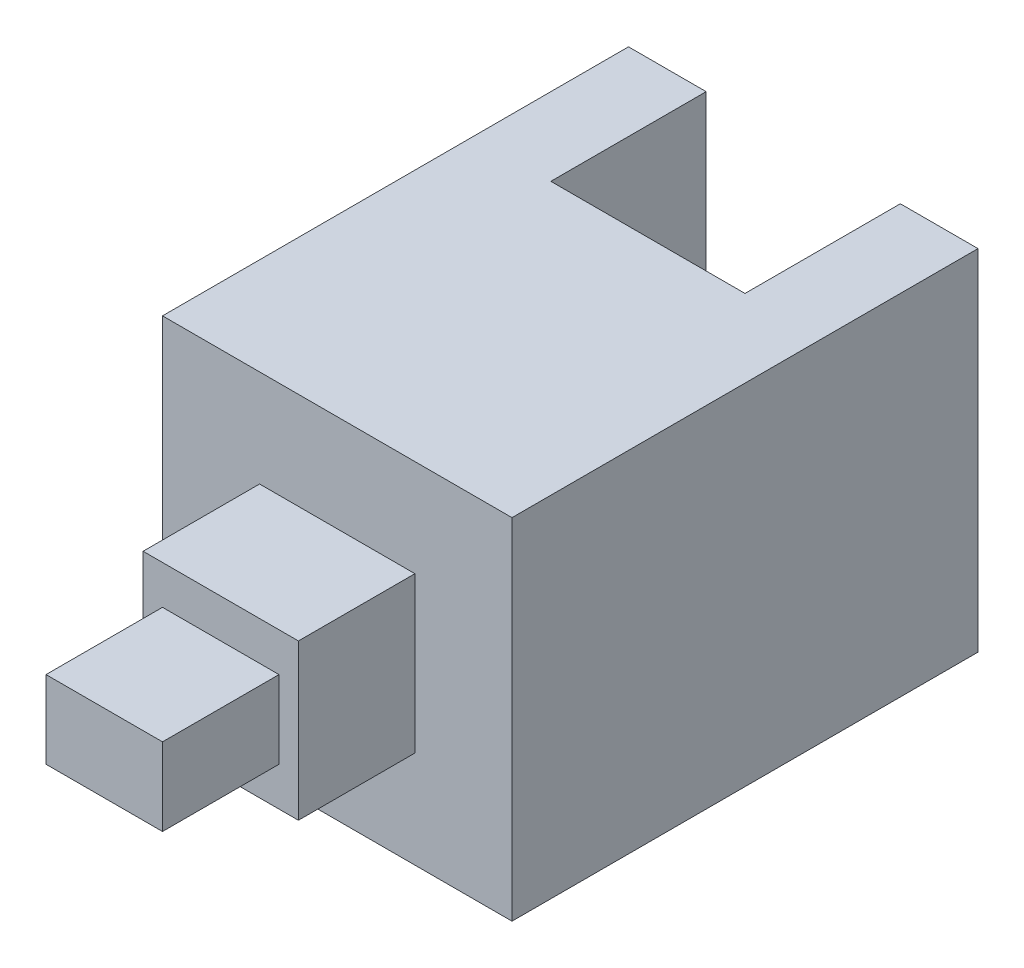
ISO-10303-21;
HEADER;
FILE_DESCRIPTION(('STEP AP214'),'2;1');
FILE_NAME('part.step','',(''),(''),'','','');
FILE_SCHEMA(('AUTOMOTIVE_DESIGN { 1 0 10303 214 1 1 1 1 }'));
ENDSEC;
DATA;
#1=APPLICATION_CONTEXT('core data for automotive mechanical design processes');
#2=APPLICATION_PROTOCOL_DEFINITION('international standard','automotive_design',2000,#1);
#3=PRODUCT_CONTEXT('',#1,'mechanical');
#4=PRODUCT('Part','Part','',(#3));
#5=PRODUCT_RELATED_PRODUCT_CATEGORY('part','',(#4));
#6=PRODUCT_DEFINITION_FORMATION('','',#4);
#7=PRODUCT_DEFINITION_CONTEXT('part definition',#1,'design');
#8=PRODUCT_DEFINITION('design','',#6,#7);
#9=PRODUCT_DEFINITION_SHAPE('','',#8);
#10=(LENGTH_UNIT() NAMED_UNIT(*) SI_UNIT(.MILLI.,.METRE.));
#11=(NAMED_UNIT(*) PLANE_ANGLE_UNIT() SI_UNIT($,.RADIAN.));
#12=(NAMED_UNIT(*) SI_UNIT($,.STERADIAN.) SOLID_ANGLE_UNIT());
#13=UNCERTAINTY_MEASURE_WITH_UNIT(LENGTH_MEASURE(1.E-05),#10,'distance_accuracy_value','');
#14=(GEOMETRIC_REPRESENTATION_CONTEXT(3) GLOBAL_UNCERTAINTY_ASSIGNED_CONTEXT((#13)) GLOBAL_UNIT_ASSIGNED_CONTEXT((#10,
#11,#12)) REPRESENTATION_CONTEXT('',''));
#15=CARTESIAN_POINT('',(0.,0.,0.));
#16=DIRECTION('',(0.,0.,1.));
#17=DIRECTION('',(1.,0.,0.));
#18=AXIS2_PLACEMENT_3D('',#15,#16,#17);
#19=CARTESIAN_POINT('',(0.,0.,0.));
#20=DIRECTION('',(0.,0.,1.));
#21=DIRECTION('',(1.,0.,0.));
#22=AXIS2_PLACEMENT_3D('',#19,#20,#21);
#23=PLANE('',#22);
#24=DIRECTION('',(0.,-1.,0.));
#25=VECTOR('',#24,1.);
#26=CARTESIAN_POINT('',(-2.5,4.5,0.));
#27=LINE('',#26,#25);
#28=CARTESIAN_POINT('',(-2.5,4.5,0.));
#29=VERTEX_POINT('',#28);
#30=CARTESIAN_POINT('',(-2.5,-4.5,0.));
#31=VERTEX_POINT('',#30);
#32=EDGE_CURVE('E177',#29,#31,#27,.T.);
#33=ORIENTED_EDGE('',*,*,#32,.F.);
#34=DIRECTION('',(-1.,0.,0.));
#35=VECTOR('',#34,1.);
#36=CARTESIAN_POINT('',(-4.5,4.5,0.));
#37=LINE('',#36,#35);
#38=CARTESIAN_POINT('',(2.5,4.5,0.));
#39=VERTEX_POINT('',#38);
#40=EDGE_CURVE('E306',#39,#29,#37,.T.);
#41=ORIENTED_EDGE('',*,*,#40,.F.);
#42=DIRECTION('',(0.,1.,0.));
#43=VECTOR('',#42,1.);
#44=CARTESIAN_POINT('',(2.5,4.5,0.));
#45=LINE('',#44,#43);
#46=CARTESIAN_POINT('',(2.5,-4.5,0.));
#47=VERTEX_POINT('',#46);
#48=EDGE_CURVE('E190',#47,#39,#45,.T.);
#49=ORIENTED_EDGE('',*,*,#48,.F.);
#50=DIRECTION('',(1.,0.,0.));
#51=VECTOR('',#50,1.);
#52=CARTESIAN_POINT('',(-4.5,-4.5,0.));
#53=LINE('',#52,#51);
#54=EDGE_CURVE('E60',#31,#47,#53,.T.);
#55=ORIENTED_EDGE('',*,*,#54,.F.);
#56=EDGE_LOOP('',(#33,#41,#49,#55));
#57=FACE_BOUND('',#56,.T.);
#58=ADVANCED_FACE('F39',(#57),#23,.F.);
#59=CARTESIAN_POINT('',(4.5,4.5,8.));
#60=DIRECTION('',(-1.,0.,0.));
#61=DIRECTION('',(0.,-1.,0.));
#62=AXIS2_PLACEMENT_3D('',#59,#60,#61);
#63=PLANE('',#62);
#64=DIRECTION('',(0.,0.,-1.));
#65=VECTOR('',#64,1.);
#66=CARTESIAN_POINT('',(4.5,-4.5,8.));
#67=LINE('',#66,#65);
#68=CARTESIAN_POINT('',(4.5,-4.5,8.));
#69=VERTEX_POINT('',#68);
#70=CARTESIAN_POINT('',(4.5,-4.5,-4.));
#71=VERTEX_POINT('',#70);
#72=EDGE_CURVE('E319',#69,#71,#67,.T.);
#73=ORIENTED_EDGE('',*,*,#72,.T.);
#74=DIRECTION('',(0.,-1.,0.));
#75=VECTOR('',#74,1.);
#76=CARTESIAN_POINT('',(4.5,4.5,-4.));
#77=LINE('',#76,#75);
#78=CARTESIAN_POINT('',(4.5,4.5,-4.));
#79=VERTEX_POINT('',#78);
#80=EDGE_CURVE('E191',#79,#71,#77,.T.);
#81=ORIENTED_EDGE('',*,*,#80,.F.);
#82=DIRECTION('',(0.,0.,-1.));
#83=VECTOR('',#82,1.);
#84=CARTESIAN_POINT('',(4.5,4.5,8.));
#85=LINE('',#84,#83);
#86=CARTESIAN_POINT('',(4.5,4.5,8.));
#87=VERTEX_POINT('',#86);
#88=EDGE_CURVE('E11',#87,#79,#85,.T.);
#89=ORIENTED_EDGE('',*,*,#88,.F.);
#90=DIRECTION('',(0.,1.,0.));
#91=VECTOR('',#90,1.);
#92=CARTESIAN_POINT('',(4.5,4.5,8.));
#93=LINE('',#92,#91);
#94=EDGE_CURVE('E307',#69,#87,#93,.T.);
#95=ORIENTED_EDGE('',*,*,#94,.F.);
#96=EDGE_LOOP('',(#73,#81,#89,#95));
#97=FACE_BOUND('',#96,.T.);
#98=ADVANCED_FACE('F41',(#97),#63,.F.);
#99=CARTESIAN_POINT('',(-4.5,4.5,8.));
#100=DIRECTION('',(0.,-1.,0.));
#101=DIRECTION('',(0.,0.,-1.));
#102=AXIS2_PLACEMENT_3D('',#99,#100,#101);
#103=PLANE('',#102);
#104=ORIENTED_EDGE('',*,*,#88,.T.);
#105=DIRECTION('',(1.,0.,0.));
#106=VECTOR('',#105,1.);
#107=CARTESIAN_POINT('',(4.5,4.5,-4.));
#108=LINE('',#107,#106);
#109=CARTESIAN_POINT('',(2.5,4.5,-4.));
#110=VERTEX_POINT('',#109);
#111=EDGE_CURVE('E201',#110,#79,#108,.T.);
#112=ORIENTED_EDGE('',*,*,#111,.F.);
#113=DIRECTION('',(0.,0.,1.));
#114=VECTOR('',#113,1.);
#115=CARTESIAN_POINT('',(2.5,4.5,-4.));
#116=LINE('',#115,#114);
#117=EDGE_CURVE('E205',#110,#39,#116,.T.);
#118=ORIENTED_EDGE('',*,*,#117,.T.);
#119=ORIENTED_EDGE('',*,*,#40,.T.);
#120=DIRECTION('',(0.,0.,1.));
#121=VECTOR('',#120,1.);
#122=CARTESIAN_POINT('',(-2.5,4.5,-4.));
#123=LINE('',#122,#121);
#124=CARTESIAN_POINT('',(-2.5,4.5,-4.));
#125=VERTEX_POINT('',#124);
#126=EDGE_CURVE('E167',#125,#29,#123,.T.);
#127=ORIENTED_EDGE('',*,*,#126,.F.);
#128=DIRECTION('',(1.,0.,0.));
#129=VECTOR('',#128,1.);
#130=CARTESIAN_POINT('',(-4.5,4.5,-4.));
#131=LINE('',#130,#129);
#132=CARTESIAN_POINT('',(-4.5,4.5,-4.));
#133=VERTEX_POINT('',#132);
#134=EDGE_CURVE('E164',#133,#125,#131,.T.);
#135=ORIENTED_EDGE('',*,*,#134,.F.);
#136=DIRECTION('',(0.,0.,-1.));
#137=VECTOR('',#136,1.);
#138=CARTESIAN_POINT('',(-4.5,4.5,8.));
#139=LINE('',#138,#137);
#140=CARTESIAN_POINT('',(-4.5,4.5,8.));
#141=VERTEX_POINT('',#140);
#142=EDGE_CURVE('E48',#141,#133,#139,.T.);
#143=ORIENTED_EDGE('',*,*,#142,.F.);
#144=DIRECTION('',(-1.,0.,0.));
#145=VECTOR('',#144,1.);
#146=CARTESIAN_POINT('',(-4.5,4.5,8.));
#147=LINE('',#146,#145);
#148=EDGE_CURVE('E311',#87,#141,#147,.T.);
#149=ORIENTED_EDGE('',*,*,#148,.F.);
#150=EDGE_LOOP('',(#104,#112,#118,#119,#127,#135,#143,#149));
#151=FACE_BOUND('',#150,.T.);
#152=ADVANCED_FACE('F165',(#151),#103,.F.);
#153=CARTESIAN_POINT('',(-4.5,4.5,8.));
#154=DIRECTION('',(1.,0.,0.));
#155=DIRECTION('',(0.,1.,0.));
#156=AXIS2_PLACEMENT_3D('',#153,#154,#155);
#157=PLANE('',#156);
#158=ORIENTED_EDGE('',*,*,#142,.T.);
#159=DIRECTION('',(0.,1.,0.));
#160=VECTOR('',#159,1.);
#161=CARTESIAN_POINT('',(-4.5,4.5,-4.));
#162=LINE('',#161,#160);
#163=CARTESIAN_POINT('',(-4.5,-4.5,-4.));
#164=VERTEX_POINT('',#163);
#165=EDGE_CURVE('E158',#164,#133,#162,.T.);
#166=ORIENTED_EDGE('',*,*,#165,.F.);
#167=DIRECTION('',(0.,0.,-1.));
#168=VECTOR('',#167,1.);
#169=CARTESIAN_POINT('',(-4.5,-4.5,8.));
#170=LINE('',#169,#168);
#171=CARTESIAN_POINT('',(-4.5,-4.5,8.));
#172=VERTEX_POINT('',#171);
#173=EDGE_CURVE('E162',#172,#164,#170,.T.);
#174=ORIENTED_EDGE('',*,*,#173,.F.);
#175=DIRECTION('',(0.,-1.,0.));
#176=VECTOR('',#175,1.);
#177=CARTESIAN_POINT('',(-4.5,4.5,8.));
#178=LINE('',#177,#176);
#179=EDGE_CURVE('E159',#141,#172,#178,.T.);
#180=ORIENTED_EDGE('',*,*,#179,.F.);
#181=EDGE_LOOP('',(#158,#166,#174,#180));
#182=FACE_BOUND('',#181,.T.);
#183=ADVANCED_FACE('F155',(#182),#157,.F.);
#184=CARTESIAN_POINT('',(-4.5,-4.5,8.));
#185=DIRECTION('',(0.,1.,0.));
#186=DIRECTION('',(0.,0.,1.));
#187=AXIS2_PLACEMENT_3D('',#184,#185,#186);
#188=PLANE('',#187);
#189=ORIENTED_EDGE('',*,*,#173,.T.);
#190=DIRECTION('',(-1.,0.,0.));
#191=VECTOR('',#190,1.);
#192=CARTESIAN_POINT('',(-4.5,-4.5,-4.));
#193=LINE('',#192,#191);
#194=CARTESIAN_POINT('',(-2.5,-4.5,-4.));
#195=VERTEX_POINT('',#194);
#196=EDGE_CURVE('E175',#195,#164,#193,.T.);
#197=ORIENTED_EDGE('',*,*,#196,.F.);
#198=DIRECTION('',(0.,0.,1.));
#199=VECTOR('',#198,1.);
#200=CARTESIAN_POINT('',(-2.5,-4.5,-4.));
#201=LINE('',#200,#199);
#202=EDGE_CURVE('E55',#195,#31,#201,.T.);
#203=ORIENTED_EDGE('',*,*,#202,.T.);
#204=ORIENTED_EDGE('',*,*,#54,.T.);
#205=DIRECTION('',(0.,0.,1.));
#206=VECTOR('',#205,1.);
#207=CARTESIAN_POINT('',(2.5,-4.5,-4.));
#208=LINE('',#207,#206);
#209=CARTESIAN_POINT('',(2.5,-4.5,-4.));
#210=VERTEX_POINT('',#209);
#211=EDGE_CURVE('E212',#210,#47,#208,.T.);
#212=ORIENTED_EDGE('',*,*,#211,.F.);
#213=DIRECTION('',(-1.,0.,0.));
#214=VECTOR('',#213,1.);
#215=CARTESIAN_POINT('',(4.5,-4.5,-4.));
#216=LINE('',#215,#214);
#217=EDGE_CURVE('E195',#71,#210,#216,.T.);
#218=ORIENTED_EDGE('',*,*,#217,.F.);
#219=ORIENTED_EDGE('',*,*,#72,.F.);
#220=DIRECTION('',(1.,0.,0.));
#221=VECTOR('',#220,1.);
#222=CARTESIAN_POINT('',(-4.5,-4.5,8.));
#223=LINE('',#222,#221);
#224=EDGE_CURVE('E316',#172,#69,#223,.T.);
#225=ORIENTED_EDGE('',*,*,#224,.F.);
#226=EDGE_LOOP('',(#189,#197,#203,#204,#212,#218,#219,#225));
#227=FACE_BOUND('',#226,.T.);
#228=ADVANCED_FACE('F328',(#227),#188,.F.);
#229=CARTESIAN_POINT('',(0.,0.,8.));
#230=DIRECTION('',(0.,0.,1.));
#231=DIRECTION('',(1.,0.,0.));
#232=AXIS2_PLACEMENT_3D('',#229,#230,#231);
#233=PLANE('',#232);
#234=DIRECTION('',(0.,1.,0.));
#235=VECTOR('',#234,1.);
#236=CARTESIAN_POINT('',(2.,2.,8.));
#237=LINE('',#236,#235);
#238=CARTESIAN_POINT('',(2.,-2.,8.));
#239=VERTEX_POINT('',#238);
#240=CARTESIAN_POINT('',(2.,2.,8.));
#241=VERTEX_POINT('',#240);
#242=EDGE_CURVE('E261',#239,#241,#237,.T.);
#243=ORIENTED_EDGE('',*,*,#242,.F.);
#244=DIRECTION('',(1.,0.,0.));
#245=VECTOR('',#244,1.);
#246=CARTESIAN_POINT('',(-2.,-2.,8.));
#247=LINE('',#246,#245);
#248=CARTESIAN_POINT('',(-2.,-2.,8.));
#249=VERTEX_POINT('',#248);
#250=EDGE_CURVE('E267',#249,#239,#247,.T.);
#251=ORIENTED_EDGE('',*,*,#250,.F.);
#252=DIRECTION('',(0.,-1.,0.));
#253=VECTOR('',#252,1.);
#254=CARTESIAN_POINT('',(-2.,2.,8.));
#255=LINE('',#254,#253);
#256=CARTESIAN_POINT('',(-2.,2.,8.));
#257=VERTEX_POINT('',#256);
#258=EDGE_CURVE('E284',#257,#249,#255,.T.);
#259=ORIENTED_EDGE('',*,*,#258,.F.);
#260=DIRECTION('',(-1.,0.,0.));
#261=VECTOR('',#260,1.);
#262=CARTESIAN_POINT('',(-2.,2.,8.));
#263=LINE('',#262,#261);
#264=EDGE_CURVE('E280',#241,#257,#263,.T.);
#265=ORIENTED_EDGE('',*,*,#264,.F.);
#266=EDGE_LOOP('',(#243,#251,#259,#265));
#267=FACE_BOUND('',#266,.T.);
#268=ORIENTED_EDGE('',*,*,#94,.T.);
#269=ORIENTED_EDGE('',*,*,#148,.T.);
#270=ORIENTED_EDGE('',*,*,#179,.T.);
#271=ORIENTED_EDGE('',*,*,#224,.T.);
#272=EDGE_LOOP('',(#268,#269,#270,#271));
#273=FACE_BOUND('',#272,.T.);
#274=ADVANCED_FACE('F333',(#267,#273),#233,.T.);
#275=CARTESIAN_POINT('',(2.,2.,11.));
#276=DIRECTION('',(-1.,0.,0.));
#277=DIRECTION('',(0.,-1.,0.));
#278=AXIS2_PLACEMENT_3D('',#275,#276,#277);
#279=PLANE('',#278);
#280=ORIENTED_EDGE('',*,*,#242,.T.);
#281=DIRECTION('',(0.,0.,-1.));
#282=VECTOR('',#281,1.);
#283=CARTESIAN_POINT('',(2.,2.,11.));
#284=LINE('',#283,#282);
#285=CARTESIAN_POINT('',(2.,2.,11.));
#286=VERTEX_POINT('',#285);
#287=EDGE_CURVE('E302',#286,#241,#284,.T.);
#288=ORIENTED_EDGE('',*,*,#287,.F.);
#289=DIRECTION('',(0.,1.,0.));
#290=VECTOR('',#289,1.);
#291=CARTESIAN_POINT('',(2.,2.,11.));
#292=LINE('',#291,#290);
#293=CARTESIAN_POINT('',(2.,-2.,11.));
#294=VERTEX_POINT('',#293);
#295=EDGE_CURVE('E262',#294,#286,#292,.T.);
#296=ORIENTED_EDGE('',*,*,#295,.F.);
#297=DIRECTION('',(0.,0.,-1.));
#298=VECTOR('',#297,1.);
#299=CARTESIAN_POINT('',(2.,-2.,11.));
#300=LINE('',#299,#298);
#301=EDGE_CURVE('E276',#294,#239,#300,.T.);
#302=ORIENTED_EDGE('',*,*,#301,.T.);
#303=EDGE_LOOP('',(#280,#288,#296,#302));
#304=FACE_BOUND('',#303,.T.);
#305=ADVANCED_FACE('F387',(#304),#279,.F.);
#306=CARTESIAN_POINT('',(-2.,2.,11.));
#307=DIRECTION('',(0.,-1.,0.));
#308=DIRECTION('',(0.,0.,-1.));
#309=AXIS2_PLACEMENT_3D('',#306,#307,#308);
#310=PLANE('',#309);
#311=ORIENTED_EDGE('',*,*,#264,.T.);
#312=DIRECTION('',(0.,0.,-1.));
#313=VECTOR('',#312,1.);
#314=CARTESIAN_POINT('',(-2.,2.,11.));
#315=LINE('',#314,#313);
#316=CARTESIAN_POINT('',(-2.,2.,11.));
#317=VERTEX_POINT('',#316);
#318=EDGE_CURVE('E298',#317,#257,#315,.T.);
#319=ORIENTED_EDGE('',*,*,#318,.F.);
#320=DIRECTION('',(-1.,0.,0.));
#321=VECTOR('',#320,1.);
#322=CARTESIAN_POINT('',(-2.,2.,11.));
#323=LINE('',#322,#321);
#324=EDGE_CURVE('E266',#286,#317,#323,.T.);
#325=ORIENTED_EDGE('',*,*,#324,.F.);
#326=ORIENTED_EDGE('',*,*,#287,.T.);
#327=EDGE_LOOP('',(#311,#319,#325,#326));
#328=FACE_BOUND('',#327,.T.);
#329=ADVANCED_FACE('F394',(#328),#310,.F.);
#330=CARTESIAN_POINT('',(-2.,2.,11.));
#331=DIRECTION('',(1.,0.,0.));
#332=DIRECTION('',(0.,1.,0.));
#333=AXIS2_PLACEMENT_3D('',#330,#331,#332);
#334=PLANE('',#333);
#335=ORIENTED_EDGE('',*,*,#258,.T.);
#336=DIRECTION('',(0.,0.,-1.));
#337=VECTOR('',#336,1.);
#338=CARTESIAN_POINT('',(-2.,-2.,11.));
#339=LINE('',#338,#337);
#340=CARTESIAN_POINT('',(-2.,-2.,11.));
#341=VERTEX_POINT('',#340);
#342=EDGE_CURVE('E294',#341,#249,#339,.T.);
#343=ORIENTED_EDGE('',*,*,#342,.F.);
#344=DIRECTION('',(0.,-1.,0.));
#345=VECTOR('',#344,1.);
#346=CARTESIAN_POINT('',(-2.,2.,11.));
#347=LINE('',#346,#345);
#348=EDGE_CURVE('E270',#317,#341,#347,.T.);
#349=ORIENTED_EDGE('',*,*,#348,.F.);
#350=ORIENTED_EDGE('',*,*,#318,.T.);
#351=EDGE_LOOP('',(#335,#343,#349,#350));
#352=FACE_BOUND('',#351,.T.);
#353=ADVANCED_FACE('F401',(#352),#334,.F.);
#354=CARTESIAN_POINT('',(-2.,-2.,11.));
#355=DIRECTION('',(0.,1.,0.));
#356=DIRECTION('',(0.,0.,1.));
#357=AXIS2_PLACEMENT_3D('',#354,#355,#356);
#358=PLANE('',#357);
#359=ORIENTED_EDGE('',*,*,#250,.T.);
#360=ORIENTED_EDGE('',*,*,#301,.F.);
#361=DIRECTION('',(1.,0.,0.));
#362=VECTOR('',#361,1.);
#363=CARTESIAN_POINT('',(-2.,-2.,11.));
#364=LINE('',#363,#362);
#365=EDGE_CURVE('E273',#341,#294,#364,.T.);
#366=ORIENTED_EDGE('',*,*,#365,.F.);
#367=ORIENTED_EDGE('',*,*,#342,.T.);
#368=EDGE_LOOP('',(#359,#360,#366,#367));
#369=FACE_BOUND('',#368,.T.);
#370=ADVANCED_FACE('F409',(#369),#358,.F.);
#371=CARTESIAN_POINT('',(0.,0.,11.));
#372=DIRECTION('',(0.,0.,1.));
#373=DIRECTION('',(1.,0.,0.));
#374=AXIS2_PLACEMENT_3D('',#371,#372,#373);
#375=PLANE('',#374);
#376=DIRECTION('',(0.,-1.,0.));
#377=VECTOR('',#376,1.);
#378=CARTESIAN_POINT('',(-1.5,1.,11.));
#379=LINE('',#378,#377);
#380=CARTESIAN_POINT('',(-1.5,1.,11.));
#381=VERTEX_POINT('',#380);
#382=CARTESIAN_POINT('',(-1.5,-1.,11.));
#383=VERTEX_POINT('',#382);
#384=EDGE_CURVE('E216',#381,#383,#379,.T.);
#385=ORIENTED_EDGE('',*,*,#384,.F.);
#386=DIRECTION('',(-1.,0.,0.));
#387=VECTOR('',#386,1.);
#388=CARTESIAN_POINT('',(-1.5,1.,11.));
#389=LINE('',#388,#387);
#390=CARTESIAN_POINT('',(1.5,1.,11.));
#391=VERTEX_POINT('',#390);
#392=EDGE_CURVE('E222',#391,#381,#389,.T.);
#393=ORIENTED_EDGE('',*,*,#392,.F.);
#394=DIRECTION('',(0.,1.,0.));
#395=VECTOR('',#394,1.);
#396=CARTESIAN_POINT('',(1.5,1.,11.));
#397=LINE('',#396,#395);
#398=CARTESIAN_POINT('',(1.5,-1.,11.));
#399=VERTEX_POINT('',#398);
#400=EDGE_CURVE('E239',#399,#391,#397,.T.);
#401=ORIENTED_EDGE('',*,*,#400,.F.);
#402=DIRECTION('',(1.,0.,0.));
#403=VECTOR('',#402,1.);
#404=CARTESIAN_POINT('',(-1.5,-1.,11.));
#405=LINE('',#404,#403);
#406=EDGE_CURVE('E235',#383,#399,#405,.T.);
#407=ORIENTED_EDGE('',*,*,#406,.F.);
#408=EDGE_LOOP('',(#385,#393,#401,#407));
#409=FACE_BOUND('',#408,.T.);
#410=ORIENTED_EDGE('',*,*,#295,.T.);
#411=ORIENTED_EDGE('',*,*,#324,.T.);
#412=ORIENTED_EDGE('',*,*,#348,.T.);
#413=ORIENTED_EDGE('',*,*,#365,.T.);
#414=EDGE_LOOP('',(#410,#411,#412,#413));
#415=FACE_BOUND('',#414,.T.);
#416=ADVANCED_FACE('F417',(#409,#415),#375,.T.);
#417=CARTESIAN_POINT('',(-1.5,1.,14.));
#418=DIRECTION('',(1.,0.,0.));
#419=DIRECTION('',(0.,1.,0.));
#420=AXIS2_PLACEMENT_3D('',#417,#418,#419);
#421=PLANE('',#420);
#422=ORIENTED_EDGE('',*,*,#384,.T.);
#423=DIRECTION('',(0.,0.,-1.));
#424=VECTOR('',#423,1.);
#425=CARTESIAN_POINT('',(-1.5,-1.,14.));
#426=LINE('',#425,#424);
#427=CARTESIAN_POINT('',(-1.5,-1.,14.));
#428=VERTEX_POINT('',#427);
#429=EDGE_CURVE('E257',#428,#383,#426,.T.);
#430=ORIENTED_EDGE('',*,*,#429,.F.);
#431=DIRECTION('',(0.,-1.,0.));
#432=VECTOR('',#431,1.);
#433=CARTESIAN_POINT('',(-1.5,1.,14.));
#434=LINE('',#433,#432);
#435=CARTESIAN_POINT('',(-1.5,1.,14.));
#436=VERTEX_POINT('',#435);
#437=EDGE_CURVE('E217',#436,#428,#434,.T.);
#438=ORIENTED_EDGE('',*,*,#437,.F.);
#439=DIRECTION('',(0.,0.,-1.));
#440=VECTOR('',#439,1.);
#441=CARTESIAN_POINT('',(-1.5,1.,14.));
#442=LINE('',#441,#440);
#443=EDGE_CURVE('E231',#436,#381,#442,.T.);
#444=ORIENTED_EDGE('',*,*,#443,.T.);
#445=EDGE_LOOP('',(#422,#430,#438,#444));
#446=FACE_BOUND('',#445,.T.);
#447=ADVANCED_FACE('F425',(#446),#421,.F.);
#448=CARTESIAN_POINT('',(-1.5,-1.,14.));
#449=DIRECTION('',(0.,1.,0.));
#450=DIRECTION('',(0.,0.,1.));
#451=AXIS2_PLACEMENT_3D('',#448,#449,#450);
#452=PLANE('',#451);
#453=ORIENTED_EDGE('',*,*,#406,.T.);
#454=DIRECTION('',(0.,0.,-1.));
#455=VECTOR('',#454,1.);
#456=CARTESIAN_POINT('',(1.5,-1.,14.));
#457=LINE('',#456,#455);
#458=CARTESIAN_POINT('',(1.5,-1.,14.));
#459=VERTEX_POINT('',#458);
#460=EDGE_CURVE('E253',#459,#399,#457,.T.);
#461=ORIENTED_EDGE('',*,*,#460,.F.);
#462=DIRECTION('',(1.,0.,0.));
#463=VECTOR('',#462,1.);
#464=CARTESIAN_POINT('',(-1.5,-1.,14.));
#465=LINE('',#464,#463);
#466=EDGE_CURVE('E221',#428,#459,#465,.T.);
#467=ORIENTED_EDGE('',*,*,#466,.F.);
#468=ORIENTED_EDGE('',*,*,#429,.T.);
#469=EDGE_LOOP('',(#453,#461,#467,#468));
#470=FACE_BOUND('',#469,.T.);
#471=ADVANCED_FACE('F433',(#470),#452,.F.);
#472=CARTESIAN_POINT('',(1.5,1.,14.));
#473=DIRECTION('',(-1.,0.,0.));
#474=DIRECTION('',(0.,0.,1.));
#475=AXIS2_PLACEMENT_3D('',#472,#473,#474);
#476=PLANE('',#475);
#477=ORIENTED_EDGE('',*,*,#400,.T.);
#478=DIRECTION('',(0.,0.,-1.));
#479=VECTOR('',#478,1.);
#480=CARTESIAN_POINT('',(1.5,1.,14.));
#481=LINE('',#480,#479);
#482=CARTESIAN_POINT('',(1.5,1.,14.));
#483=VERTEX_POINT('',#482);
#484=EDGE_CURVE('E249',#483,#391,#481,.T.);
#485=ORIENTED_EDGE('',*,*,#484,.F.);
#486=DIRECTION('',(0.,1.,0.));
#487=VECTOR('',#486,1.);
#488=CARTESIAN_POINT('',(1.5,1.,14.));
#489=LINE('',#488,#487);
#490=EDGE_CURVE('E225',#459,#483,#489,.T.);
#491=ORIENTED_EDGE('',*,*,#490,.F.);
#492=ORIENTED_EDGE('',*,*,#460,.T.);
#493=EDGE_LOOP('',(#477,#485,#491,#492));
#494=FACE_BOUND('',#493,.T.);
#495=ADVANCED_FACE('F441',(#494),#476,.F.);
#496=CARTESIAN_POINT('',(-1.5,1.,14.));
#497=DIRECTION('',(0.,-1.,0.));
#498=DIRECTION('',(0.,0.,-1.));
#499=AXIS2_PLACEMENT_3D('',#496,#497,#498);
#500=PLANE('',#499);
#501=ORIENTED_EDGE('',*,*,#392,.T.);
#502=ORIENTED_EDGE('',*,*,#443,.F.);
#503=DIRECTION('',(-1.,0.,0.));
#504=VECTOR('',#503,1.);
#505=CARTESIAN_POINT('',(-1.5,1.,14.));
#506=LINE('',#505,#504);
#507=EDGE_CURVE('E228',#483,#436,#506,.T.);
#508=ORIENTED_EDGE('',*,*,#507,.F.);
#509=ORIENTED_EDGE('',*,*,#484,.T.);
#510=EDGE_LOOP('',(#501,#502,#508,#509));
#511=FACE_BOUND('',#510,.T.);
#512=ADVANCED_FACE('F449',(#511),#500,.F.);
#513=CARTESIAN_POINT('',(0.,0.,14.));
#514=DIRECTION('',(0.,0.,1.));
#515=DIRECTION('',(1.,0.,0.));
#516=AXIS2_PLACEMENT_3D('',#513,#514,#515);
#517=PLANE('',#516);
#518=ORIENTED_EDGE('',*,*,#437,.T.);
#519=ORIENTED_EDGE('',*,*,#466,.T.);
#520=ORIENTED_EDGE('',*,*,#490,.T.);
#521=ORIENTED_EDGE('',*,*,#507,.T.);
#522=EDGE_LOOP('',(#518,#519,#520,#521));
#523=FACE_BOUND('',#522,.T.);
#524=ADVANCED_FACE('F457',(#523),#517,.T.);
#525=CARTESIAN_POINT('',(2.5,4.5,-4.));
#526=DIRECTION('',(1.,0.,0.));
#527=DIRECTION('',(0.,1.,0.));
#528=AXIS2_PLACEMENT_3D('',#525,#526,#527);
#529=PLANE('',#528);
#530=ORIENTED_EDGE('',*,*,#48,.T.);
#531=ORIENTED_EDGE('',*,*,#117,.F.);
#532=DIRECTION('',(0.,1.,0.));
#533=VECTOR('',#532,1.);
#534=CARTESIAN_POINT('',(2.5,4.5,-4.));
#535=LINE('',#534,#533);
#536=EDGE_CURVE('E198',#210,#110,#535,.T.);
#537=ORIENTED_EDGE('',*,*,#536,.F.);
#538=ORIENTED_EDGE('',*,*,#211,.T.);
#539=EDGE_LOOP('',(#530,#531,#537,#538));
#540=FACE_BOUND('',#539,.T.);
#541=ADVANCED_FACE('F343',(#540),#529,.F.);
#542=CARTESIAN_POINT('',(0.,0.,-4.));
#543=DIRECTION('',(0.,0.,-1.));
#544=DIRECTION('',(-1.,0.,0.));
#545=AXIS2_PLACEMENT_3D('',#542,#543,#544);
#546=PLANE('',#545);
#547=ORIENTED_EDGE('',*,*,#80,.T.);
#548=ORIENTED_EDGE('',*,*,#217,.T.);
#549=ORIENTED_EDGE('',*,*,#536,.T.);
#550=ORIENTED_EDGE('',*,*,#111,.T.);
#551=EDGE_LOOP('',(#547,#548,#549,#550));
#552=FACE_BOUND('',#551,.T.);
#553=ADVANCED_FACE('F339',(#552),#546,.T.);
#554=CARTESIAN_POINT('',(-2.5,4.5,-4.));
#555=DIRECTION('',(-1.,0.,0.));
#556=DIRECTION('',(0.,-1.,0.));
#557=AXIS2_PLACEMENT_3D('',#554,#555,#556);
#558=PLANE('',#557);
#559=ORIENTED_EDGE('',*,*,#32,.T.);
#560=ORIENTED_EDGE('',*,*,#202,.F.);
#561=DIRECTION('',(0.,-1.,0.));
#562=VECTOR('',#561,1.);
#563=CARTESIAN_POINT('',(-2.5,4.5,-4.));
#564=LINE('',#563,#562);
#565=EDGE_CURVE('E171',#125,#195,#564,.T.);
#566=ORIENTED_EDGE('',*,*,#565,.F.);
#567=ORIENTED_EDGE('',*,*,#126,.T.);
#568=EDGE_LOOP('',(#559,#560,#566,#567));
#569=FACE_BOUND('',#568,.T.);
#570=ADVANCED_FACE('F347',(#569),#558,.F.);
#571=CARTESIAN_POINT('',(0.,0.,-4.));
#572=DIRECTION('',(0.,0.,1.));
#573=DIRECTION('',(1.,0.,0.));
#574=AXIS2_PLACEMENT_3D('',#571,#572,#573);
#575=PLANE('',#574);
#576=ORIENTED_EDGE('',*,*,#165,.T.);
#577=ORIENTED_EDGE('',*,*,#134,.T.);
#578=ORIENTED_EDGE('',*,*,#565,.T.);
#579=ORIENTED_EDGE('',*,*,#196,.T.);
#580=EDGE_LOOP('',(#576,#577,#578,#579));
#581=FACE_BOUND('',#580,.T.);
#582=ADVANCED_FACE('F174',(#581),#575,.F.);
#583=CLOSED_SHELL('',(#58,#98,#152,#183,#228,#274,#305,#329,#353,#370,#416,#447,#471,#495,#512,
#524,#541,#553,#570,#582));
#584=MANIFOLD_SOLID_BREP('B2',#583);
#585=ADVANCED_BREP_SHAPE_REPRESENTATION('',(#18,#584),#14);
#586=SHAPE_DEFINITION_REPRESENTATION(#9,#585);
ENDSEC;
END-ISO-10303-21;
